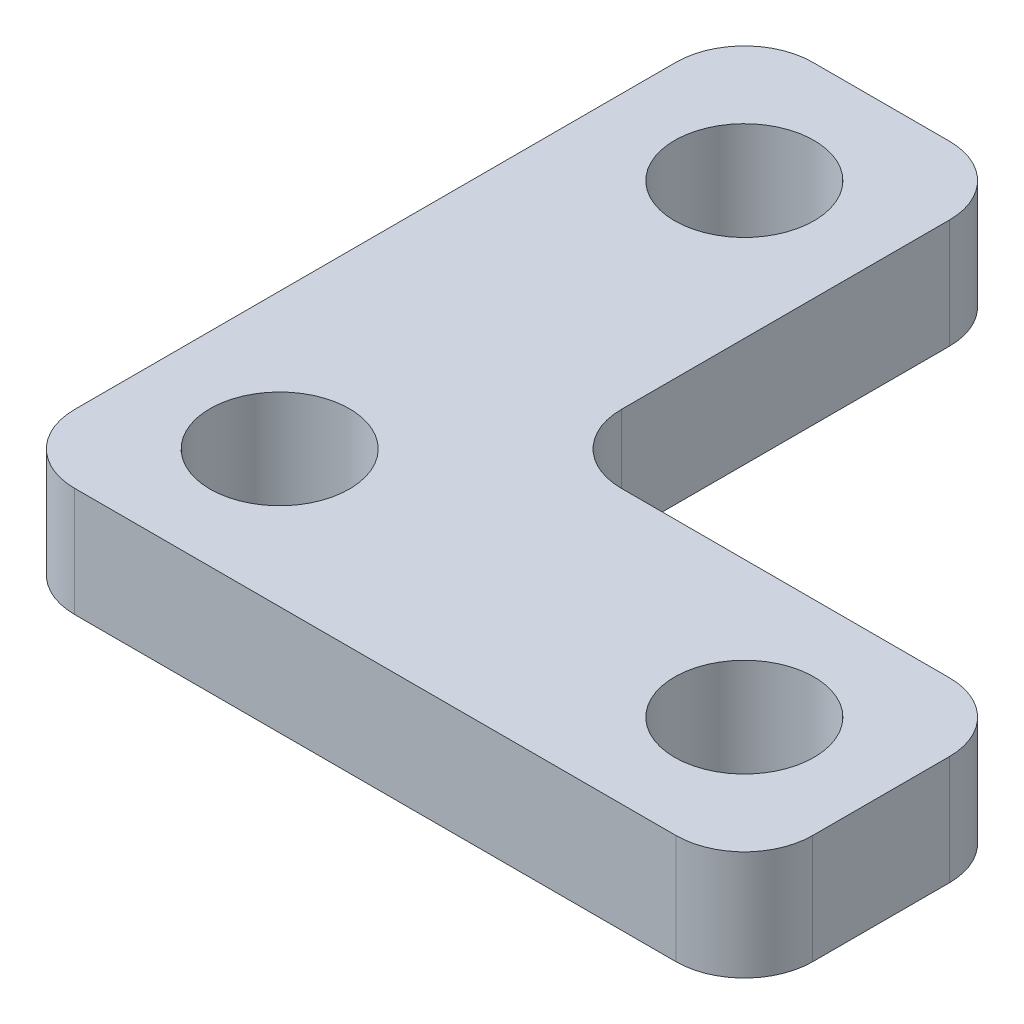
ISO-10303-21;
HEADER;
FILE_DESCRIPTION(('STEP AP214'),'2;1');
FILE_NAME('part.step','',(''),(''),'','','');
FILE_SCHEMA(('AUTOMOTIVE_DESIGN { 1 0 10303 214 1 1 1 1 }'));
ENDSEC;
DATA;
#1=APPLICATION_CONTEXT('core data for automotive mechanical design processes');
#2=APPLICATION_PROTOCOL_DEFINITION('international standard','automotive_design',2000,#1);
#3=PRODUCT_CONTEXT('',#1,'mechanical');
#4=PRODUCT('Part','Part','',(#3));
#5=PRODUCT_RELATED_PRODUCT_CATEGORY('part','',(#4));
#6=PRODUCT_DEFINITION_FORMATION('','',#4);
#7=PRODUCT_DEFINITION_CONTEXT('part definition',#1,'design');
#8=PRODUCT_DEFINITION('design','',#6,#7);
#9=PRODUCT_DEFINITION_SHAPE('','',#8);
#10=(LENGTH_UNIT() NAMED_UNIT(*) SI_UNIT(.MILLI.,.METRE.));
#11=(NAMED_UNIT(*) PLANE_ANGLE_UNIT() SI_UNIT($,.RADIAN.));
#12=(NAMED_UNIT(*) SI_UNIT($,.STERADIAN.) SOLID_ANGLE_UNIT());
#13=UNCERTAINTY_MEASURE_WITH_UNIT(LENGTH_MEASURE(1.E-05),#10,'distance_accuracy_value','');
#14=(GEOMETRIC_REPRESENTATION_CONTEXT(3) GLOBAL_UNCERTAINTY_ASSIGNED_CONTEXT((#13)) GLOBAL_UNIT_ASSIGNED_CONTEXT((#10,
#11,#12)) REPRESENTATION_CONTEXT('',''));
#15=CARTESIAN_POINT('',(0.,0.,0.));
#16=DIRECTION('',(0.,0.,1.));
#17=DIRECTION('',(1.,0.,0.));
#18=AXIS2_PLACEMENT_3D('',#15,#16,#17);
#19=CARTESIAN_POINT('',(12.5,4.,-12.5));
#20=DIRECTION('',(0.,1.,0.));
#21=DIRECTION('',(0.,0.,1.));
#22=AXIS2_PLACEMENT_3D('',#19,#20,#21);
#23=PLANE('',#22);
#24=CARTESIAN_POINT('',(5.,4.,-5.));
#25=DIRECTION('',(0.,1.,0.));
#26=DIRECTION('',(0.,0.,1.));
#27=AXIS2_PLACEMENT_3D('',#24,#25,#26);
#28=CIRCLE('',#27,2.55);
#29=CARTESIAN_POINT('',(5.,4.,-2.45));
#30=VERTEX_POINT('',#29);
#31=EDGE_CURVE('E291',#30,#30,#28,.T.);
#32=ORIENTED_EDGE('',*,*,#31,.F.);
#33=EDGE_LOOP('',(#32));
#34=FACE_BOUND('',#33,.T.);
#35=CARTESIAN_POINT('',(12.5,4.,-12.5));
#36=DIRECTION('',(0.,-1.,0.));
#37=DIRECTION('',(0.,0.,1.));
#38=AXIS2_PLACEMENT_3D('',#35,#36,#37);
#39=CIRCLE('',#38,2.5);
#40=CARTESIAN_POINT('',(12.5,4.,-10.));
#41=VERTEX_POINT('',#40);
#42=CARTESIAN_POINT('',(10.,4.,-12.5));
#43=VERTEX_POINT('',#42);
#44=EDGE_CURVE('E182',#41,#43,#39,.T.);
#45=ORIENTED_EDGE('',*,*,#44,.T.);
#46=DIRECTION('',(0.,0.,-1.));
#47=VECTOR('',#46,1.);
#48=CARTESIAN_POINT('',(10.,4.,-24.5));
#49=LINE('',#48,#47);
#50=CARTESIAN_POINT('',(10.,4.,-24.5));
#51=VERTEX_POINT('',#50);
#52=EDGE_CURVE('E110',#43,#51,#49,.T.);
#53=ORIENTED_EDGE('',*,*,#52,.T.);
#54=CARTESIAN_POINT('',(7.5,4.,-24.5));
#55=DIRECTION('',(0.,1.,0.));
#56=DIRECTION('',(0.,0.,-1.));
#57=AXIS2_PLACEMENT_3D('',#54,#55,#56);
#58=CIRCLE('',#57,2.5);
#59=CARTESIAN_POINT('',(7.5,4.,-27.));
#60=VERTEX_POINT('',#59);
#61=EDGE_CURVE('E209',#51,#60,#58,.T.);
#62=ORIENTED_EDGE('',*,*,#61,.T.);
#63=DIRECTION('',(-1.,0.,0.));
#64=VECTOR('',#63,1.);
#65=CARTESIAN_POINT('',(2.50000000000002,4.,-27.));
#66=LINE('',#65,#64);
#67=CARTESIAN_POINT('',(2.50000000000002,4.,-27.));
#68=VERTEX_POINT('',#67);
#69=EDGE_CURVE('E228',#60,#68,#66,.T.);
#70=ORIENTED_EDGE('',*,*,#69,.T.);
#71=CARTESIAN_POINT('',(2.5,4.,-24.5));
#72=DIRECTION('',(0.,1.,0.));
#73=DIRECTION('',(0.,0.,-1.));
#74=AXIS2_PLACEMENT_3D('',#71,#72,#73);
#75=CIRCLE('',#74,2.5);
#76=CARTESIAN_POINT('',(0.,4.,-24.5));
#77=VERTEX_POINT('',#76);
#78=EDGE_CURVE('E225',#68,#77,#75,.T.);
#79=ORIENTED_EDGE('',*,*,#78,.T.);
#80=DIRECTION('',(0.,0.,1.));
#81=VECTOR('',#80,1.);
#82=CARTESIAN_POINT('',(0.,4.,-2.50000000000002));
#83=LINE('',#82,#81);
#84=CARTESIAN_POINT('',(0.,4.,-2.50000000000002));
#85=VERTEX_POINT('',#84);
#86=EDGE_CURVE('E227',#77,#85,#83,.T.);
#87=ORIENTED_EDGE('',*,*,#86,.T.);
#88=CARTESIAN_POINT('',(2.5,4.,-2.5));
#89=DIRECTION('',(0.,1.,0.));
#90=DIRECTION('',(0.,0.,1.));
#91=AXIS2_PLACEMENT_3D('',#88,#89,#90);
#92=CIRCLE('',#91,2.5);
#93=CARTESIAN_POINT('',(2.5,4.,0.));
#94=VERTEX_POINT('',#93);
#95=EDGE_CURVE('E230',#85,#94,#92,.T.);
#96=ORIENTED_EDGE('',*,*,#95,.T.);
#97=DIRECTION('',(1.,0.,0.));
#98=VECTOR('',#97,1.);
#99=CARTESIAN_POINT('',(24.5,4.,0.));
#100=LINE('',#99,#98);
#101=CARTESIAN_POINT('',(24.5,4.,0.));
#102=VERTEX_POINT('',#101);
#103=EDGE_CURVE('E236',#94,#102,#100,.T.);
#104=ORIENTED_EDGE('',*,*,#103,.T.);
#105=CARTESIAN_POINT('',(24.5,4.,-2.5));
#106=DIRECTION('',(0.,1.,0.));
#107=DIRECTION('',(0.,0.,1.));
#108=AXIS2_PLACEMENT_3D('',#105,#106,#107);
#109=CIRCLE('',#108,2.5);
#110=CARTESIAN_POINT('',(27.,4.,-2.50000000000002));
#111=VERTEX_POINT('',#110);
#112=EDGE_CURVE('E141',#102,#111,#109,.T.);
#113=ORIENTED_EDGE('',*,*,#112,.T.);
#114=DIRECTION('',(0.,0.,-1.));
#115=VECTOR('',#114,1.);
#116=CARTESIAN_POINT('',(27.,4.,-7.49999999999998));
#117=LINE('',#116,#115);
#118=CARTESIAN_POINT('',(27.,4.,-7.49999999999998));
#119=VERTEX_POINT('',#118);
#120=EDGE_CURVE('E135',#111,#119,#117,.T.);
#121=ORIENTED_EDGE('',*,*,#120,.T.);
#122=CARTESIAN_POINT('',(24.5,4.,-7.5));
#123=DIRECTION('',(0.,1.,0.));
#124=DIRECTION('',(0.,0.,1.));
#125=AXIS2_PLACEMENT_3D('',#122,#123,#124);
#126=CIRCLE('',#125,2.5);
#127=CARTESIAN_POINT('',(24.5,4.,-10.));
#128=VERTEX_POINT('',#127);
#129=EDGE_CURVE('E139',#119,#128,#126,.T.);
#130=ORIENTED_EDGE('',*,*,#129,.T.);
#131=DIRECTION('',(-1.,0.,0.));
#132=VECTOR('',#131,1.);
#133=CARTESIAN_POINT('',(12.5,4.,-10.));
#134=LINE('',#133,#132);
#135=EDGE_CURVE('E55',#128,#41,#134,.T.);
#136=ORIENTED_EDGE('',*,*,#135,.T.);
#137=EDGE_LOOP('',(#45,#53,#62,#70,#79,#87,#96,#104,#113,#121,#130,#136));
#138=FACE_BOUND('',#137,.T.);
#139=CARTESIAN_POINT('',(22.,4.,-5.));
#140=DIRECTION('',(0.,1.,0.));
#141=DIRECTION('',(0.,0.,1.));
#142=AXIS2_PLACEMENT_3D('',#139,#140,#141);
#143=CIRCLE('',#142,2.55);
#144=CARTESIAN_POINT('',(22.,4.,-2.45));
#145=VERTEX_POINT('',#144);
#146=EDGE_CURVE('E163',#145,#145,#143,.T.);
#147=ORIENTED_EDGE('',*,*,#146,.F.);
#148=EDGE_LOOP('',(#147));
#149=FACE_BOUND('',#148,.T.);
#150=CARTESIAN_POINT('',(5.,4.,-22.));
#151=DIRECTION('',(0.,1.,0.));
#152=DIRECTION('',(0.,0.,1.));
#153=AXIS2_PLACEMENT_3D('',#150,#151,#152);
#154=CIRCLE('',#153,2.55);
#155=CARTESIAN_POINT('',(5.,4.,-19.45));
#156=VERTEX_POINT('',#155);
#157=EDGE_CURVE('E282',#156,#156,#154,.T.);
#158=ORIENTED_EDGE('',*,*,#157,.F.);
#159=EDGE_LOOP('',(#158));
#160=FACE_BOUND('',#159,.T.);
#161=ADVANCED_FACE('F38',(#34,#138,#149,#160),#23,.T.);
#162=CARTESIAN_POINT('',(12.5,0.,-12.5));
#163=DIRECTION('',(0.,1.,0.));
#164=DIRECTION('',(0.,0.,1.));
#165=AXIS2_PLACEMENT_3D('',#162,#163,#164);
#166=PLANE('',#165);
#167=CARTESIAN_POINT('',(12.5,0.,-12.5));
#168=DIRECTION('',(0.,-1.,0.));
#169=DIRECTION('',(0.,0.,1.));
#170=AXIS2_PLACEMENT_3D('',#167,#168,#169);
#171=CIRCLE('',#170,2.5);
#172=CARTESIAN_POINT('',(12.5,0.,-10.));
#173=VERTEX_POINT('',#172);
#174=CARTESIAN_POINT('',(10.,0.,-12.5));
#175=VERTEX_POINT('',#174);
#176=EDGE_CURVE('E159',#173,#175,#171,.T.);
#177=ORIENTED_EDGE('',*,*,#176,.F.);
#178=DIRECTION('',(-1.,0.,0.));
#179=VECTOR('',#178,1.);
#180=CARTESIAN_POINT('',(12.5,0.,-10.));
#181=LINE('',#180,#179);
#182=CARTESIAN_POINT('',(24.5,0.,-10.));
#183=VERTEX_POINT('',#182);
#184=EDGE_CURVE('E102',#183,#173,#181,.T.);
#185=ORIENTED_EDGE('',*,*,#184,.F.);
#186=CARTESIAN_POINT('',(24.5,0.,-7.5));
#187=DIRECTION('',(0.,1.,0.));
#188=DIRECTION('',(0.,0.,1.));
#189=AXIS2_PLACEMENT_3D('',#186,#187,#188);
#190=CIRCLE('',#189,2.5);
#191=CARTESIAN_POINT('',(27.,0.,-7.49999999999998));
#192=VERTEX_POINT('',#191);
#193=EDGE_CURVE('E96',#192,#183,#190,.T.);
#194=ORIENTED_EDGE('',*,*,#193,.F.);
#195=DIRECTION('',(0.,0.,-1.));
#196=VECTOR('',#195,1.);
#197=CARTESIAN_POINT('',(27.,0.,-7.49999999999998));
#198=LINE('',#197,#196);
#199=CARTESIAN_POINT('',(27.,0.,-2.50000000000002));
#200=VERTEX_POINT('',#199);
#201=EDGE_CURVE('E149',#200,#192,#198,.T.);
#202=ORIENTED_EDGE('',*,*,#201,.F.);
#203=CARTESIAN_POINT('',(24.5,0.,-2.5));
#204=DIRECTION('',(0.,1.,0.));
#205=DIRECTION('',(0.,0.,1.));
#206=AXIS2_PLACEMENT_3D('',#203,#204,#205);
#207=CIRCLE('',#206,2.5);
#208=CARTESIAN_POINT('',(24.5,0.,0.));
#209=VERTEX_POINT('',#208);
#210=EDGE_CURVE('E177',#209,#200,#207,.T.);
#211=ORIENTED_EDGE('',*,*,#210,.F.);
#212=DIRECTION('',(1.,0.,0.));
#213=VECTOR('',#212,1.);
#214=CARTESIAN_POINT('',(24.5,0.,0.));
#215=LINE('',#214,#213);
#216=CARTESIAN_POINT('',(2.5,0.,0.));
#217=VERTEX_POINT('',#216);
#218=EDGE_CURVE('E175',#217,#209,#215,.T.);
#219=ORIENTED_EDGE('',*,*,#218,.F.);
#220=CARTESIAN_POINT('',(2.5,0.,-2.5));
#221=DIRECTION('',(0.,1.,0.));
#222=DIRECTION('',(0.,0.,1.));
#223=AXIS2_PLACEMENT_3D('',#220,#221,#222);
#224=CIRCLE('',#223,2.5);
#225=CARTESIAN_POINT('',(0.,0.,-2.50000000000002));
#226=VERTEX_POINT('',#225);
#227=EDGE_CURVE('E173',#226,#217,#224,.T.);
#228=ORIENTED_EDGE('',*,*,#227,.F.);
#229=DIRECTION('',(0.,0.,1.));
#230=VECTOR('',#229,1.);
#231=CARTESIAN_POINT('',(0.,0.,-2.50000000000002));
#232=LINE('',#231,#230);
#233=CARTESIAN_POINT('',(0.,0.,-24.5));
#234=VERTEX_POINT('',#233);
#235=EDGE_CURVE('E171',#234,#226,#232,.T.);
#236=ORIENTED_EDGE('',*,*,#235,.F.);
#237=CARTESIAN_POINT('',(2.5,0.,-24.5));
#238=DIRECTION('',(0.,1.,0.));
#239=DIRECTION('',(0.,0.,-1.));
#240=AXIS2_PLACEMENT_3D('',#237,#238,#239);
#241=CIRCLE('',#240,2.5);
#242=CARTESIAN_POINT('',(2.50000000000002,0.,-27.));
#243=VERTEX_POINT('',#242);
#244=EDGE_CURVE('E169',#243,#234,#241,.T.);
#245=ORIENTED_EDGE('',*,*,#244,.F.);
#246=DIRECTION('',(-1.,0.,0.));
#247=VECTOR('',#246,1.);
#248=CARTESIAN_POINT('',(2.50000000000002,0.,-27.));
#249=LINE('',#248,#247);
#250=CARTESIAN_POINT('',(7.5,0.,-27.));
#251=VERTEX_POINT('',#250);
#252=EDGE_CURVE('E167',#251,#243,#249,.T.);
#253=ORIENTED_EDGE('',*,*,#252,.F.);
#254=CARTESIAN_POINT('',(7.5,0.,-24.5));
#255=DIRECTION('',(0.,1.,0.));
#256=DIRECTION('',(0.,0.,-1.));
#257=AXIS2_PLACEMENT_3D('',#254,#255,#256);
#258=CIRCLE('',#257,2.5);
#259=CARTESIAN_POINT('',(10.,0.,-24.5));
#260=VERTEX_POINT('',#259);
#261=EDGE_CURVE('E165',#260,#251,#258,.T.);
#262=ORIENTED_EDGE('',*,*,#261,.F.);
#263=DIRECTION('',(0.,0.,-1.));
#264=VECTOR('',#263,1.);
#265=CARTESIAN_POINT('',(10.,0.,-24.5));
#266=LINE('',#265,#264);
#267=EDGE_CURVE('E162',#175,#260,#266,.T.);
#268=ORIENTED_EDGE('',*,*,#267,.F.);
#269=EDGE_LOOP('',(#177,#185,#194,#202,#211,#219,#228,#236,#245,#253,#262,#268));
#270=FACE_BOUND('',#269,.T.);
#271=CARTESIAN_POINT('',(22.,0.,-5.));
#272=DIRECTION('',(0.,1.,0.));
#273=DIRECTION('',(0.,0.,1.));
#274=AXIS2_PLACEMENT_3D('',#271,#272,#273);
#275=CIRCLE('',#274,2.55);
#276=CARTESIAN_POINT('',(22.,0.,-2.45));
#277=VERTEX_POINT('',#276);
#278=EDGE_CURVE('E294',#277,#277,#275,.T.);
#279=ORIENTED_EDGE('',*,*,#278,.T.);
#280=EDGE_LOOP('',(#279));
#281=FACE_BOUND('',#280,.T.);
#282=CARTESIAN_POINT('',(5.,0.,-5.));
#283=DIRECTION('',(0.,1.,0.));
#284=DIRECTION('',(0.,0.,1.));
#285=AXIS2_PLACEMENT_3D('',#282,#283,#284);
#286=CIRCLE('',#285,2.55);
#287=CARTESIAN_POINT('',(5.,0.,-2.45));
#288=VERTEX_POINT('',#287);
#289=EDGE_CURVE('E288',#288,#288,#286,.T.);
#290=ORIENTED_EDGE('',*,*,#289,.T.);
#291=EDGE_LOOP('',(#290));
#292=FACE_BOUND('',#291,.T.);
#293=CARTESIAN_POINT('',(5.,0.,-22.));
#294=DIRECTION('',(0.,1.,0.));
#295=DIRECTION('',(0.,0.,1.));
#296=AXIS2_PLACEMENT_3D('',#293,#294,#295);
#297=CIRCLE('',#296,2.55);
#298=CARTESIAN_POINT('',(5.,0.,-19.45));
#299=VERTEX_POINT('',#298);
#300=EDGE_CURVE('E285',#299,#299,#297,.T.);
#301=ORIENTED_EDGE('',*,*,#300,.T.);
#302=EDGE_LOOP('',(#301));
#303=FACE_BOUND('',#302,.T.);
#304=ADVANCED_FACE('F213',(#270,#281,#292,#303),#166,.F.);
#305=CARTESIAN_POINT('',(12.5,4.,-12.5));
#306=DIRECTION('',(0.,-1.,0.));
#307=DIRECTION('',(0.,0.,-1.));
#308=AXIS2_PLACEMENT_3D('',#305,#306,#307);
#309=CYLINDRICAL_SURFACE('',#308,2.5);
#310=ORIENTED_EDGE('',*,*,#176,.T.);
#311=DIRECTION('',(0.,-1.,0.));
#312=VECTOR('',#311,1.);
#313=CARTESIAN_POINT('',(10.,4.,-12.5));
#314=LINE('',#313,#312);
#315=EDGE_CURVE('E11',#43,#175,#314,.T.);
#316=ORIENTED_EDGE('',*,*,#315,.F.);
#317=ORIENTED_EDGE('',*,*,#44,.F.);
#318=DIRECTION('',(0.,-1.,0.));
#319=VECTOR('',#318,1.);
#320=CARTESIAN_POINT('',(12.5,4.,-10.));
#321=LINE('',#320,#319);
#322=EDGE_CURVE('E155',#41,#173,#321,.T.);
#323=ORIENTED_EDGE('',*,*,#322,.T.);
#324=EDGE_LOOP('',(#310,#316,#317,#323));
#325=FACE_BOUND('',#324,.T.);
#326=ADVANCED_FACE('F40',(#325),#309,.F.);
#327=CARTESIAN_POINT('',(10.,4.,-24.5));
#328=DIRECTION('',(-1.,0.,0.));
#329=DIRECTION('',(0.,0.,1.));
#330=AXIS2_PLACEMENT_3D('',#327,#328,#329);
#331=PLANE('',#330);
#332=ORIENTED_EDGE('',*,*,#267,.T.);
#333=DIRECTION('',(0.,-1.,0.));
#334=VECTOR('',#333,1.);
#335=CARTESIAN_POINT('',(10.,4.,-24.5));
#336=LINE('',#335,#334);
#337=EDGE_CURVE('E47',#51,#260,#336,.T.);
#338=ORIENTED_EDGE('',*,*,#337,.F.);
#339=ORIENTED_EDGE('',*,*,#52,.F.);
#340=ORIENTED_EDGE('',*,*,#315,.T.);
#341=EDGE_LOOP('',(#332,#338,#339,#340));
#342=FACE_BOUND('',#341,.T.);
#343=ADVANCED_FACE('F406',(#342),#331,.F.);
#344=CARTESIAN_POINT('',(7.5,4.,-24.5));
#345=DIRECTION('',(0.,-1.,0.));
#346=DIRECTION('',(0.,0.,-1.));
#347=AXIS2_PLACEMENT_3D('',#344,#345,#346);
#348=CYLINDRICAL_SURFACE('',#347,2.5);
#349=ORIENTED_EDGE('',*,*,#261,.T.);
#350=DIRECTION('',(0.,-1.,0.));
#351=VECTOR('',#350,1.);
#352=CARTESIAN_POINT('',(7.5,4.,-27.));
#353=LINE('',#352,#351);
#354=EDGE_CURVE('E201',#60,#251,#353,.T.);
#355=ORIENTED_EDGE('',*,*,#354,.F.);
#356=ORIENTED_EDGE('',*,*,#61,.F.);
#357=ORIENTED_EDGE('',*,*,#337,.T.);
#358=EDGE_LOOP('',(#349,#355,#356,#357));
#359=FACE_BOUND('',#358,.T.);
#360=ADVANCED_FACE('F207',(#359),#348,.T.);
#361=CARTESIAN_POINT('',(2.50000000000002,4.,-27.));
#362=DIRECTION('',(0.,0.,1.));
#363=DIRECTION('',(1.,0.,0.));
#364=AXIS2_PLACEMENT_3D('',#361,#362,#363);
#365=PLANE('',#364);
#366=ORIENTED_EDGE('',*,*,#252,.T.);
#367=DIRECTION('',(0.,-1.,0.));
#368=VECTOR('',#367,1.);
#369=CARTESIAN_POINT('',(2.50000000000002,4.,-27.));
#370=LINE('',#369,#368);
#371=EDGE_CURVE('E198',#68,#243,#370,.T.);
#372=ORIENTED_EDGE('',*,*,#371,.F.);
#373=ORIENTED_EDGE('',*,*,#69,.F.);
#374=ORIENTED_EDGE('',*,*,#354,.T.);
#375=EDGE_LOOP('',(#366,#372,#373,#374));
#376=FACE_BOUND('',#375,.T.);
#377=ADVANCED_FACE('F219',(#376),#365,.F.);
#378=CARTESIAN_POINT('',(2.5,4.,-24.5));
#379=DIRECTION('',(0.,-1.,0.));
#380=DIRECTION('',(0.,0.,-1.));
#381=AXIS2_PLACEMENT_3D('',#378,#379,#380);
#382=CYLINDRICAL_SURFACE('',#381,2.5);
#383=ORIENTED_EDGE('',*,*,#244,.T.);
#384=DIRECTION('',(0.,-1.,0.));
#385=VECTOR('',#384,1.);
#386=CARTESIAN_POINT('',(0.,4.,-24.5));
#387=LINE('',#386,#385);
#388=EDGE_CURVE('E195',#77,#234,#387,.T.);
#389=ORIENTED_EDGE('',*,*,#388,.F.);
#390=ORIENTED_EDGE('',*,*,#78,.F.);
#391=ORIENTED_EDGE('',*,*,#371,.T.);
#392=EDGE_LOOP('',(#383,#389,#390,#391));
#393=FACE_BOUND('',#392,.T.);
#394=ADVANCED_FACE('F223',(#393),#382,.T.);
#395=CARTESIAN_POINT('',(0.,4.,-2.50000000000002));
#396=DIRECTION('',(1.,0.,0.));
#397=DIRECTION('',(0.,0.,-1.));
#398=AXIS2_PLACEMENT_3D('',#395,#396,#397);
#399=PLANE('',#398);
#400=ORIENTED_EDGE('',*,*,#235,.T.);
#401=DIRECTION('',(0.,-1.,0.));
#402=VECTOR('',#401,1.);
#403=CARTESIAN_POINT('',(0.,4.,-2.50000000000002));
#404=LINE('',#403,#402);
#405=EDGE_CURVE('E192',#85,#226,#404,.T.);
#406=ORIENTED_EDGE('',*,*,#405,.F.);
#407=ORIENTED_EDGE('',*,*,#86,.F.);
#408=ORIENTED_EDGE('',*,*,#388,.T.);
#409=EDGE_LOOP('',(#400,#406,#407,#408));
#410=FACE_BOUND('',#409,.T.);
#411=ADVANCED_FACE('F367',(#410),#399,.F.);
#412=CARTESIAN_POINT('',(2.5,4.,-2.5));
#413=DIRECTION('',(0.,-1.,0.));
#414=DIRECTION('',(0.,0.,-1.));
#415=AXIS2_PLACEMENT_3D('',#412,#413,#414);
#416=CYLINDRICAL_SURFACE('',#415,2.5);
#417=ORIENTED_EDGE('',*,*,#227,.T.);
#418=DIRECTION('',(0.,-1.,0.));
#419=VECTOR('',#418,1.);
#420=CARTESIAN_POINT('',(2.5,4.,0.));
#421=LINE('',#420,#419);
#422=EDGE_CURVE('E189',#94,#217,#421,.T.);
#423=ORIENTED_EDGE('',*,*,#422,.F.);
#424=ORIENTED_EDGE('',*,*,#95,.F.);
#425=ORIENTED_EDGE('',*,*,#405,.T.);
#426=EDGE_LOOP('',(#417,#423,#424,#425));
#427=FACE_BOUND('',#426,.T.);
#428=ADVANCED_FACE('F357',(#427),#416,.T.);
#429=CARTESIAN_POINT('',(24.5,4.,0.));
#430=DIRECTION('',(0.,0.,-1.));
#431=DIRECTION('',(-1.,0.,0.));
#432=AXIS2_PLACEMENT_3D('',#429,#430,#431);
#433=PLANE('',#432);
#434=ORIENTED_EDGE('',*,*,#218,.T.);
#435=DIRECTION('',(0.,-1.,0.));
#436=VECTOR('',#435,1.);
#437=CARTESIAN_POINT('',(24.5,4.,0.));
#438=LINE('',#437,#436);
#439=EDGE_CURVE('E186',#102,#209,#438,.T.);
#440=ORIENTED_EDGE('',*,*,#439,.F.);
#441=ORIENTED_EDGE('',*,*,#103,.F.);
#442=ORIENTED_EDGE('',*,*,#422,.T.);
#443=EDGE_LOOP('',(#434,#440,#441,#442));
#444=FACE_BOUND('',#443,.T.);
#445=ADVANCED_FACE('F242',(#444),#433,.F.);
#446=CARTESIAN_POINT('',(24.5,4.,-2.5));
#447=DIRECTION('',(0.,-1.,0.));
#448=DIRECTION('',(0.,0.,-1.));
#449=AXIS2_PLACEMENT_3D('',#446,#447,#448);
#450=CYLINDRICAL_SURFACE('',#449,2.5);
#451=ORIENTED_EDGE('',*,*,#210,.T.);
#452=DIRECTION('',(0.,-1.,0.));
#453=VECTOR('',#452,1.);
#454=CARTESIAN_POINT('',(27.,4.,-2.50000000000002));
#455=LINE('',#454,#453);
#456=EDGE_CURVE('E150',#111,#200,#455,.T.);
#457=ORIENTED_EDGE('',*,*,#456,.F.);
#458=ORIENTED_EDGE('',*,*,#112,.F.);
#459=ORIENTED_EDGE('',*,*,#439,.T.);
#460=EDGE_LOOP('',(#451,#457,#458,#459));
#461=FACE_BOUND('',#460,.T.);
#462=ADVANCED_FACE('F246',(#461),#450,.T.);
#463=CARTESIAN_POINT('',(27.,4.,-7.49999999999998));
#464=DIRECTION('',(-1.,0.,0.));
#465=DIRECTION('',(0.,0.,1.));
#466=AXIS2_PLACEMENT_3D('',#463,#464,#465);
#467=PLANE('',#466);
#468=ORIENTED_EDGE('',*,*,#201,.T.);
#469=DIRECTION('',(0.,-1.,0.));
#470=VECTOR('',#469,1.);
#471=CARTESIAN_POINT('',(27.,4.,-7.49999999999998));
#472=LINE('',#471,#470);
#473=EDGE_CURVE('E146',#119,#192,#472,.T.);
#474=ORIENTED_EDGE('',*,*,#473,.F.);
#475=ORIENTED_EDGE('',*,*,#120,.F.);
#476=ORIENTED_EDGE('',*,*,#456,.T.);
#477=EDGE_LOOP('',(#468,#474,#475,#476));
#478=FACE_BOUND('',#477,.T.);
#479=ADVANCED_FACE('F147',(#478),#467,.F.);
#480=CARTESIAN_POINT('',(24.5,4.,-7.5));
#481=DIRECTION('',(0.,-1.,0.));
#482=DIRECTION('',(0.,0.,-1.));
#483=AXIS2_PLACEMENT_3D('',#480,#481,#482);
#484=CYLINDRICAL_SURFACE('',#483,2.5);
#485=ORIENTED_EDGE('',*,*,#193,.T.);
#486=DIRECTION('',(0.,-1.,0.));
#487=VECTOR('',#486,1.);
#488=CARTESIAN_POINT('',(24.5,4.,-10.));
#489=LINE('',#488,#487);
#490=EDGE_CURVE('E151',#128,#183,#489,.T.);
#491=ORIENTED_EDGE('',*,*,#490,.F.);
#492=ORIENTED_EDGE('',*,*,#129,.F.);
#493=ORIENTED_EDGE('',*,*,#473,.T.);
#494=EDGE_LOOP('',(#485,#491,#492,#493));
#495=FACE_BOUND('',#494,.T.);
#496=ADVANCED_FACE('F153',(#495),#484,.T.);
#497=CARTESIAN_POINT('',(12.5,4.,-10.));
#498=DIRECTION('',(0.,0.,1.));
#499=DIRECTION('',(1.,0.,0.));
#500=AXIS2_PLACEMENT_3D('',#497,#498,#499);
#501=PLANE('',#500);
#502=ORIENTED_EDGE('',*,*,#184,.T.);
#503=ORIENTED_EDGE('',*,*,#322,.F.);
#504=ORIENTED_EDGE('',*,*,#135,.F.);
#505=ORIENTED_EDGE('',*,*,#490,.T.);
#506=EDGE_LOOP('',(#502,#503,#504,#505));
#507=FACE_BOUND('',#506,.T.);
#508=ADVANCED_FACE('F250',(#507),#501,.F.);
#509=CARTESIAN_POINT('',(22.,4.,-5.));
#510=DIRECTION('',(0.,-1.,0.));
#511=DIRECTION('',(0.,0.,-1.));
#512=AXIS2_PLACEMENT_3D('',#509,#510,#511);
#513=CYLINDRICAL_SURFACE('',#512,2.55);
#514=ORIENTED_EDGE('',*,*,#146,.T.);
#515=EDGE_LOOP('',(#514));
#516=FACE_BOUND('',#515,.T.);
#517=ORIENTED_EDGE('',*,*,#278,.F.);
#518=EDGE_LOOP('',(#517));
#519=FACE_BOUND('',#518,.T.);
#520=ADVANCED_FACE('F252',(#516,#519),#513,.F.);
#521=CARTESIAN_POINT('',(5.,4.,-5.));
#522=DIRECTION('',(0.,-1.,0.));
#523=DIRECTION('',(0.,0.,-1.));
#524=AXIS2_PLACEMENT_3D('',#521,#522,#523);
#525=CYLINDRICAL_SURFACE('',#524,2.55);
#526=ORIENTED_EDGE('',*,*,#31,.T.);
#527=EDGE_LOOP('',(#526));
#528=FACE_BOUND('',#527,.T.);
#529=ORIENTED_EDGE('',*,*,#289,.F.);
#530=EDGE_LOOP('',(#529));
#531=FACE_BOUND('',#530,.T.);
#532=ADVANCED_FACE('F258',(#528,#531),#525,.F.);
#533=CARTESIAN_POINT('',(5.,4.,-22.));
#534=DIRECTION('',(0.,-1.,0.));
#535=DIRECTION('',(0.,0.,-1.));
#536=AXIS2_PLACEMENT_3D('',#533,#534,#535);
#537=CYLINDRICAL_SURFACE('',#536,2.55);
#538=ORIENTED_EDGE('',*,*,#157,.T.);
#539=EDGE_LOOP('',(#538));
#540=FACE_BOUND('',#539,.T.);
#541=ORIENTED_EDGE('',*,*,#300,.F.);
#542=EDGE_LOOP('',(#541));
#543=FACE_BOUND('',#542,.T.);
#544=ADVANCED_FACE('F273',(#540,#543),#537,.F.);
#545=CLOSED_SHELL('',(#161,#304,#326,#343,#360,#377,#394,#411,#428,#445,#462,#479,#496,#508,
#520,#532,#544));
#546=MANIFOLD_SOLID_BREP('B2',#545);
#547=ADVANCED_BREP_SHAPE_REPRESENTATION('',(#18,#546),#14);
#548=SHAPE_DEFINITION_REPRESENTATION(#9,#547);
ENDSEC;
END-ISO-10303-21;
